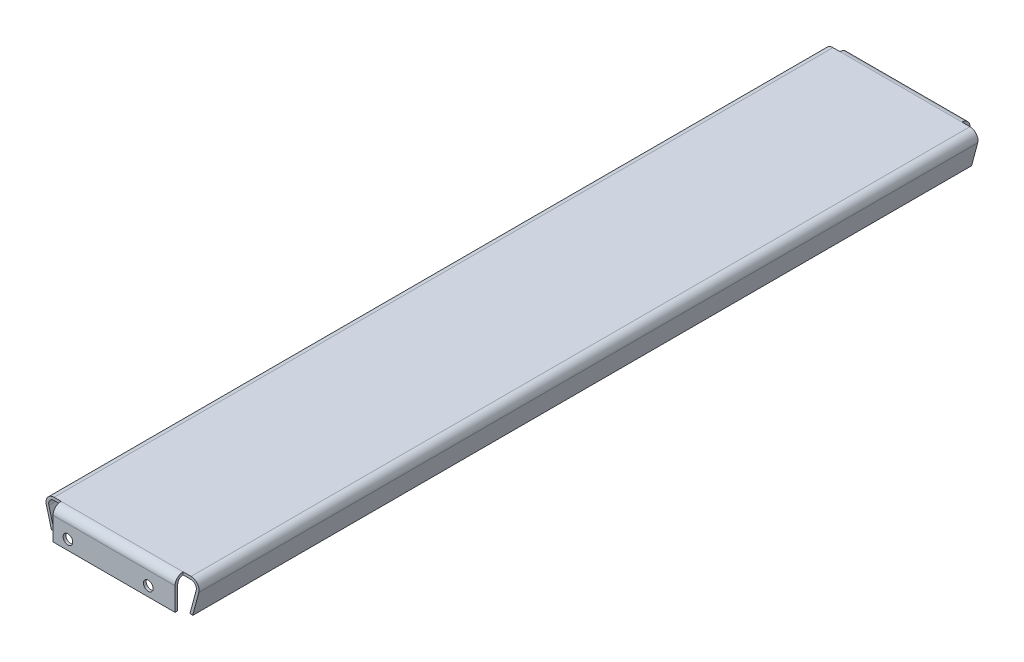
ISO-10303-21;
HEADER;
FILE_DESCRIPTION(('STEP AP214'),'2;1');
FILE_NAME('part.step','',(''),(''),'','','');
FILE_SCHEMA(('AUTOMOTIVE_DESIGN { 1 0 10303 214 1 1 1 1 }'));
ENDSEC;
DATA;
#1=APPLICATION_CONTEXT('core data for automotive mechanical design processes');
#2=APPLICATION_PROTOCOL_DEFINITION('international standard','automotive_design',2000,#1);
#3=PRODUCT_CONTEXT('',#1,'mechanical');
#4=PRODUCT('Part','Part','',(#3));
#5=PRODUCT_RELATED_PRODUCT_CATEGORY('part','',(#4));
#6=PRODUCT_DEFINITION_FORMATION('','',#4);
#7=PRODUCT_DEFINITION_CONTEXT('part definition',#1,'design');
#8=PRODUCT_DEFINITION('design','',#6,#7);
#9=PRODUCT_DEFINITION_SHAPE('','',#8);
#10=(LENGTH_UNIT() NAMED_UNIT(*) SI_UNIT(.MILLI.,.METRE.));
#11=(NAMED_UNIT(*) PLANE_ANGLE_UNIT() SI_UNIT($,.RADIAN.));
#12=(NAMED_UNIT(*) SI_UNIT($,.STERADIAN.) SOLID_ANGLE_UNIT());
#13=UNCERTAINTY_MEASURE_WITH_UNIT(LENGTH_MEASURE(1.E-05),#10,'distance_accuracy_value','');
#14=(GEOMETRIC_REPRESENTATION_CONTEXT(3) GLOBAL_UNCERTAINTY_ASSIGNED_CONTEXT((#13)) GLOBAL_UNIT_ASSIGNED_CONTEXT((#10,
#11,#12)) REPRESENTATION_CONTEXT('',''));
#15=CARTESIAN_POINT('',(0.,0.,0.));
#16=DIRECTION('',(0.,0.,1.));
#17=DIRECTION('',(1.,0.,0.));
#18=AXIS2_PLACEMENT_3D('',#15,#16,#17);
#19=CARTESIAN_POINT('',(105.011062785215,-8.89529991418879,-302.426822511449));
#20=DIRECTION('',(0.,1.,0.));
#21=DIRECTION('',(0.,0.,1.));
#22=AXIS2_PLACEMENT_3D('',#19,#20,#21);
#23=PLANE('',#22);
#24=DIRECTION('',(1.,0.,0.));
#25=VECTOR('',#24,1.);
#26=CARTESIAN_POINT('',(57.3565,-8.89529991418875,-221.099));
#27=LINE('',#26,#25);
#28=CARTESIAN_POINT('',(-35.4355117298732,-8.89529991418879,-221.099));
#29=VERTEX_POINT('',#28);
#30=CARTESIAN_POINT('',(32.9178736396681,-8.89529991418879,-221.099));
#31=VERTEX_POINT('',#30);
#32=EDGE_CURVE('E271',#29,#31,#27,.T.);
#33=ORIENTED_EDGE('',*,*,#32,.F.);
#34=DIRECTION('',(0.,0.,1.));
#35=VECTOR('',#34,1.);
#36=CARTESIAN_POINT('',(-35.4355117298732,-8.89529991418879,-302.426822511449));
#37=LINE('',#36,#35);
#38=CARTESIAN_POINT('',(-35.4355117298732,-8.89529991418879,-222.599));
#39=VERTEX_POINT('',#38);
#40=EDGE_CURVE('E156',#39,#29,#37,.T.);
#41=ORIENTED_EDGE('',*,*,#40,.F.);
#42=DIRECTION('',(-1.,0.,0.));
#43=VECTOR('',#42,1.);
#44=CARTESIAN_POINT('',(-57.3565,-8.89529991418875,-222.599));
#45=LINE('',#44,#43);
#46=CARTESIAN_POINT('',(32.9178736396681,-8.89529991418879,-222.599));
#47=VERTEX_POINT('',#46);
#48=EDGE_CURVE('E286',#47,#39,#45,.T.);
#49=ORIENTED_EDGE('',*,*,#48,.F.);
#50=DIRECTION('',(0.,0.,1.));
#51=VECTOR('',#50,1.);
#52=CARTESIAN_POINT('',(32.9178736396681,-8.89529991418879,-302.426822511449));
#53=LINE('',#52,#51);
#54=EDGE_CURVE('E290',#31,#47,#53,.F.);
#55=ORIENTED_EDGE('',*,*,#54,.F.);
#56=EDGE_LOOP('',(#33,#41,#49,#55));
#57=FACE_BOUND('',#56,.T.);
#58=ADVANCED_FACE('F15',(#57),#23,.F.);
#59=CARTESIAN_POINT('',(17.9178736396681,-3.46341447025817,245.074174975933));
#60=DIRECTION('',(0.,0.,1.));
#61=DIRECTION('',(0.,-1.,0.));
#62=AXIS2_PLACEMENT_3D('',#59,#60,#61);
#63=CYLINDRICAL_SURFACE('',#62,2.7);
#64=CARTESIAN_POINT('',(17.9178736396681,-3.46341447025807,-222.599));
#65=DIRECTION('',(0.,0.,1.));
#66=DIRECTION('',(0.,-1.,0.));
#67=AXIS2_PLACEMENT_3D('',#64,#65,#66);
#68=CIRCLE('',#67,2.7);
#69=CARTESIAN_POINT('',(17.9178736396681,-6.16341447025807,-222.599));
#70=VERTEX_POINT('',#69);
#71=EDGE_CURVE('E19',#70,#70,#68,.T.);
#72=ORIENTED_EDGE('',*,*,#71,.F.);
#73=EDGE_LOOP('',(#72));
#74=FACE_BOUND('',#73,.T.);
#75=CARTESIAN_POINT('',(17.9178736396681,-3.46341447025807,-221.099));
#76=DIRECTION('',(0.,0.,1.));
#77=DIRECTION('',(0.,-1.,0.));
#78=AXIS2_PLACEMENT_3D('',#75,#76,#77);
#79=CIRCLE('',#78,2.7);
#80=CARTESIAN_POINT('',(17.9178736396681,-6.16341447025807,-221.099));
#81=VERTEX_POINT('',#80);
#82=EDGE_CURVE('E268',#81,#81,#79,.F.);
#83=ORIENTED_EDGE('',*,*,#82,.F.);
#84=EDGE_LOOP('',(#83));
#85=FACE_BOUND('',#84,.T.);
#86=ADVANCED_FACE('F667',(#74,#85),#63,.F.);
#87=CARTESIAN_POINT('',(-27.0821263603319,-3.46341447025817,245.074174975933));
#88=DIRECTION('',(0.,0.,1.));
#89=DIRECTION('',(0.,-1.,0.));
#90=AXIS2_PLACEMENT_3D('',#87,#88,#89);
#91=CYLINDRICAL_SURFACE('',#90,2.7);
#92=CARTESIAN_POINT('',(-27.0821263603319,-3.46341447025807,-222.599));
#93=DIRECTION('',(0.,0.,1.));
#94=DIRECTION('',(0.,-1.,0.));
#95=AXIS2_PLACEMENT_3D('',#92,#93,#94);
#96=CIRCLE('',#95,2.7);
#97=CARTESIAN_POINT('',(-27.0821263603319,-6.16341447025807,-222.599));
#98=VERTEX_POINT('',#97);
#99=EDGE_CURVE('E278',#98,#98,#96,.T.);
#100=ORIENTED_EDGE('',*,*,#99,.F.);
#101=EDGE_LOOP('',(#100));
#102=FACE_BOUND('',#101,.T.);
#103=CARTESIAN_POINT('',(-27.0821263603319,-3.46341447025807,-221.099));
#104=DIRECTION('',(0.,0.,1.));
#105=DIRECTION('',(0.,-1.,0.));
#106=AXIS2_PLACEMENT_3D('',#103,#104,#105);
#107=CIRCLE('',#106,2.7);
#108=CARTESIAN_POINT('',(-27.0821263603319,-6.16341447025807,-221.099));
#109=VERTEX_POINT('',#108);
#110=EDGE_CURVE('E265',#109,#109,#107,.F.);
#111=ORIENTED_EDGE('',*,*,#110,.F.);
#112=EDGE_LOOP('',(#111));
#113=FACE_BOUND('',#112,.T.);
#114=ADVANCED_FACE('F671',(#102,#113),#91,.F.);
#115=CARTESIAN_POINT('',(-57.3565,-8.89529991418879,-222.599));
#116=DIRECTION('',(0.,0.,-1.));
#117=DIRECTION('',(-1.,0.,0.));
#118=AXIS2_PLACEMENT_3D('',#115,#116,#117);
#119=PLANE('',#118);
#120=ORIENTED_EDGE('',*,*,#99,.T.);
#121=EDGE_LOOP('',(#120));
#122=FACE_BOUND('',#121,.T.);
#123=ORIENTED_EDGE('',*,*,#71,.T.);
#124=EDGE_LOOP('',(#123));
#125=FACE_BOUND('',#124,.T.);
#126=ORIENTED_EDGE('',*,*,#48,.T.);
#127=DIRECTION('',(0.,1.,0.));
#128=VECTOR('',#127,1.);
#129=CARTESIAN_POINT('',(-35.4355117298732,-0.179357192223455,-222.599));
#130=LINE('',#129,#128);
#131=CARTESIAN_POINT('',(-35.4355117298732,4.03658552974194,-222.599));
#132=VERTEX_POINT('',#131);
#133=EDGE_CURVE('E403',#39,#132,#130,.T.);
#134=ORIENTED_EDGE('',*,*,#133,.T.);
#135=DIRECTION('',(-1.,0.,0.));
#136=VECTOR('',#135,1.);
#137=CARTESIAN_POINT('',(-1.25881904510251,4.03658552974196,-222.599));
#138=LINE('',#137,#136);
#139=CARTESIAN_POINT('',(32.9178736396681,4.03658552974195,-222.599));
#140=VERTEX_POINT('',#139);
#141=EDGE_CURVE('E148',#140,#132,#138,.T.);
#142=ORIENTED_EDGE('',*,*,#141,.F.);
#143=DIRECTION('',(0.,-1.,0.));
#144=VECTOR('',#143,1.);
#145=CARTESIAN_POINT('',(32.9178736396681,-0.179357192223449,-222.599));
#146=LINE('',#145,#144);
#147=EDGE_CURVE('E260',#140,#47,#146,.T.);
#148=ORIENTED_EDGE('',*,*,#147,.T.);
#149=EDGE_LOOP('',(#126,#134,#142,#148));
#150=FACE_BOUND('',#149,.T.);
#151=ADVANCED_FACE('F498',(#122,#125,#150),#119,.T.);
#152=CARTESIAN_POINT('',(38.2627623791018,-9.96786209966535,-236.78));
#153=DIRECTION('',(-0.258819045102521,-0.965925826289068,0.));
#154=DIRECTION('',(0.965925826289068,-0.258819045102521,0.));
#155=AXIS2_PLACEMENT_3D('',#152,#153,#154);
#156=PLANE('',#155);
#157=DIRECTION('',(0.965925826289068,-0.258819045102521,0.));
#158=VECTOR('',#157,1.);
#159=CARTESIAN_POINT('',(38.2627623791018,-9.96786209966543,218.099));
#160=LINE('',#159,#158);
#161=CARTESIAN_POINT('',(38.2627623791017,-9.96786209966542,218.099));
#162=VERTEX_POINT('',#161);
#163=CARTESIAN_POINT('',(36.8138736396681,-9.57963353201164,218.099));
#164=VERTEX_POINT('',#163);
#165=EDGE_CURVE('E283',#162,#164,#160,.F.);
#166=ORIENTED_EDGE('',*,*,#165,.T.);
#167=DIRECTION('',(0.,0.,1.));
#168=VECTOR('',#167,1.);
#169=CARTESIAN_POINT('',(36.8138736396682,-9.57963353201166,-236.78));
#170=LINE('',#169,#168);
#171=CARTESIAN_POINT('',(36.8138736396681,-9.5796335320116,-218.099));
#172=VERTEX_POINT('',#171);
#173=EDGE_CURVE('E383',#172,#164,#170,.T.);
#174=ORIENTED_EDGE('',*,*,#173,.F.);
#175=DIRECTION('',(0.965925826289068,-0.258819045102521,0.));
#176=VECTOR('',#175,1.);
#177=CARTESIAN_POINT('',(38.2627623791018,-9.96786209966535,-218.099));
#178=LINE('',#177,#176);
#179=CARTESIAN_POINT('',(38.2627623791017,-9.96786209966538,-218.099));
#180=VERTEX_POINT('',#179);
#181=EDGE_CURVE('E280',#172,#180,#178,.T.);
#182=ORIENTED_EDGE('',*,*,#181,.T.);
#183=DIRECTION('',(0.,0.,1.));
#184=VECTOR('',#183,1.);
#185=CARTESIAN_POINT('',(38.2627623791017,-9.96786209966544,-236.78));
#186=LINE('',#185,#184);
#187=EDGE_CURVE('E380',#162,#180,#186,.F.);
#188=ORIENTED_EDGE('',*,*,#187,.F.);
#189=EDGE_LOOP('',(#166,#174,#182,#188));
#190=FACE_BOUND('',#189,.T.);
#191=ADVANCED_FACE('F533',(#190),#156,.T.);
#192=CARTESIAN_POINT('',(105.011062785215,-8.89529991418872,302.426822511449));
#193=DIRECTION('',(0.,-1.,0.));
#194=DIRECTION('',(0.,0.,-1.));
#195=AXIS2_PLACEMENT_3D('',#192,#193,#194);
#196=PLANE('',#195);
#197=DIRECTION('',(0.,0.,-1.));
#198=VECTOR('',#197,1.);
#199=CARTESIAN_POINT('',(-35.4355117298732,-8.89529991418872,302.426822511449));
#200=LINE('',#199,#198);
#201=CARTESIAN_POINT('',(-35.4355117298732,-8.89529991418874,222.599));
#202=VERTEX_POINT('',#201);
#203=CARTESIAN_POINT('',(-35.4355117298732,-8.89529991418874,221.099));
#204=VERTEX_POINT('',#203);
#205=EDGE_CURVE('E320',#202,#204,#200,.T.);
#206=ORIENTED_EDGE('',*,*,#205,.T.);
#207=DIRECTION('',(-1.,0.,0.));
#208=VECTOR('',#207,1.);
#209=CARTESIAN_POINT('',(57.3565,-8.89529991418875,221.099));
#210=LINE('',#209,#208);
#211=CARTESIAN_POINT('',(32.9178736396681,-8.89529991418874,221.099));
#212=VERTEX_POINT('',#211);
#213=EDGE_CURVE('E257',#212,#204,#210,.T.);
#214=ORIENTED_EDGE('',*,*,#213,.F.);
#215=DIRECTION('',(0.,0.,-1.));
#216=VECTOR('',#215,1.);
#217=CARTESIAN_POINT('',(32.9178736396681,-8.89529991418872,302.426822511449));
#218=LINE('',#217,#216);
#219=CARTESIAN_POINT('',(32.9178736396681,-8.89529991418874,222.599));
#220=VERTEX_POINT('',#219);
#221=EDGE_CURVE('E317',#212,#220,#218,.F.);
#222=ORIENTED_EDGE('',*,*,#221,.T.);
#223=DIRECTION('',(1.,0.,0.));
#224=VECTOR('',#223,1.);
#225=CARTESIAN_POINT('',(-57.3565,-8.89529991418875,222.599));
#226=LINE('',#225,#224);
#227=EDGE_CURVE('E277',#202,#220,#226,.T.);
#228=ORIENTED_EDGE('',*,*,#227,.F.);
#229=EDGE_LOOP('',(#206,#214,#222,#228));
#230=FACE_BOUND('',#229,.T.);
#231=ADVANCED_FACE('F507',(#230),#196,.T.);
#232=CARTESIAN_POINT('',(17.9178736396681,-3.46341447025807,222.599));
#233=DIRECTION('',(0.,0.,-1.));
#234=DIRECTION('',(-1.,0.,0.));
#235=AXIS2_PLACEMENT_3D('',#232,#233,#234);
#236=CYLINDRICAL_SURFACE('',#235,2.7);
#237=CARTESIAN_POINT('',(17.9178736396681,-3.46341447025807,222.599));
#238=DIRECTION('',(0.,0.,-1.));
#239=DIRECTION('',(-1.,0.,0.));
#240=AXIS2_PLACEMENT_3D('',#237,#238,#239);
#241=CIRCLE('',#240,2.7);
#242=CARTESIAN_POINT('',(15.2178736396681,-3.46341447025807,222.599));
#243=VERTEX_POINT('',#242);
#244=EDGE_CURVE('E275',#243,#243,#241,.T.);
#245=ORIENTED_EDGE('',*,*,#244,.F.);
#246=EDGE_LOOP('',(#245));
#247=FACE_BOUND('',#246,.T.);
#248=CARTESIAN_POINT('',(17.9178736396681,-3.46341447025805,221.099));
#249=DIRECTION('',(0.,0.,-1.));
#250=DIRECTION('',(-1.,0.,0.));
#251=AXIS2_PLACEMENT_3D('',#248,#249,#250);
#252=CIRCLE('',#251,2.7);
#253=CARTESIAN_POINT('',(15.2178736396681,-3.46341447025805,221.099));
#254=VERTEX_POINT('',#253);
#255=EDGE_CURVE('E254',#254,#254,#252,.F.);
#256=ORIENTED_EDGE('',*,*,#255,.F.);
#257=EDGE_LOOP('',(#256));
#258=FACE_BOUND('',#257,.T.);
#259=ADVANCED_FACE('F660',(#247,#258),#236,.F.);
#260=CARTESIAN_POINT('',(-27.0821263603319,-3.46341447025807,222.599));
#261=DIRECTION('',(0.,0.,-1.));
#262=DIRECTION('',(0.,1.,0.));
#263=AXIS2_PLACEMENT_3D('',#260,#261,#262);
#264=CYLINDRICAL_SURFACE('',#263,2.7);
#265=CARTESIAN_POINT('',(-27.0821263603319,-3.46341447025807,222.599));
#266=DIRECTION('',(0.,0.,-1.));
#267=DIRECTION('',(0.,1.,0.));
#268=AXIS2_PLACEMENT_3D('',#265,#266,#267);
#269=CIRCLE('',#268,2.7);
#270=CARTESIAN_POINT('',(-27.0821263603319,-0.763414470258064,222.599));
#271=VERTEX_POINT('',#270);
#272=EDGE_CURVE('E272',#271,#271,#269,.T.);
#273=ORIENTED_EDGE('',*,*,#272,.F.);
#274=EDGE_LOOP('',(#273));
#275=FACE_BOUND('',#274,.T.);
#276=CARTESIAN_POINT('',(-27.0821263603319,-3.46341447025805,221.099));
#277=DIRECTION('',(0.,0.,-1.));
#278=DIRECTION('',(0.,1.,0.));
#279=AXIS2_PLACEMENT_3D('',#276,#277,#278);
#280=CIRCLE('',#279,2.7);
#281=CARTESIAN_POINT('',(-27.0821263603319,-0.763414470258048,221.099));
#282=VERTEX_POINT('',#281);
#283=EDGE_CURVE('E251',#282,#282,#280,.F.);
#284=ORIENTED_EDGE('',*,*,#283,.F.);
#285=EDGE_LOOP('',(#284));
#286=FACE_BOUND('',#285,.T.);
#287=ADVANCED_FACE('F657',(#275,#286),#264,.F.);
#288=CARTESIAN_POINT('',(-57.3565,464.664700085811,222.599));
#289=DIRECTION('',(0.,0.,1.));
#290=DIRECTION('',(1.,0.,0.));
#291=AXIS2_PLACEMENT_3D('',#288,#289,#290);
#292=PLANE('',#291);
#293=ORIENTED_EDGE('',*,*,#272,.T.);
#294=EDGE_LOOP('',(#293));
#295=FACE_BOUND('',#294,.T.);
#296=ORIENTED_EDGE('',*,*,#244,.T.);
#297=EDGE_LOOP('',(#296));
#298=FACE_BOUND('',#297,.T.);
#299=ORIENTED_EDGE('',*,*,#227,.T.);
#300=DIRECTION('',(0.,1.,0.));
#301=VECTOR('',#300,1.);
#302=CARTESIAN_POINT('',(32.9178736396681,-8.89529991418875,222.599));
#303=LINE('',#302,#301);
#304=CARTESIAN_POINT('',(32.9178736396681,4.03658552974193,222.599));
#305=VERTEX_POINT('',#304);
#306=EDGE_CURVE('E354',#220,#305,#303,.T.);
#307=ORIENTED_EDGE('',*,*,#306,.T.);
#308=DIRECTION('',(1.,0.,0.));
#309=VECTOR('',#308,1.);
#310=CARTESIAN_POINT('',(-1.25881904510251,4.03658552974193,222.599));
#311=LINE('',#310,#309);
#312=CARTESIAN_POINT('',(-35.4355117298732,4.03658552974193,222.599));
#313=VERTEX_POINT('',#312);
#314=EDGE_CURVE('E304',#313,#305,#311,.T.);
#315=ORIENTED_EDGE('',*,*,#314,.F.);
#316=DIRECTION('',(0.,1.,0.));
#317=VECTOR('',#316,1.);
#318=CARTESIAN_POINT('',(-35.4355117298732,-8.89529991418875,222.599));
#319=LINE('',#318,#317);
#320=EDGE_CURVE('E246',#313,#202,#319,.F.);
#321=ORIENTED_EDGE('',*,*,#320,.T.);
#322=EDGE_LOOP('',(#299,#307,#315,#321));
#323=FACE_BOUND('',#322,.T.);
#324=ADVANCED_FACE('F353',(#295,#298,#323),#292,.T.);
#325=CARTESIAN_POINT('',(-1.25881904510251,4.03658552974193,-218.099));
#326=DIRECTION('',(-1.,0.,0.));
#327=DIRECTION('',(0.,-1.,0.));
#328=AXIS2_PLACEMENT_3D('',#325,#326,#327);
#329=CYLINDRICAL_SURFACE('',#328,4.5);
#330=CARTESIAN_POINT('',(-35.4355117298732,4.03658552974193,-218.099));
#331=DIRECTION('',(-1.,0.,0.));
#332=DIRECTION('',(0.,-1.,0.));
#333=AXIS2_PLACEMENT_3D('',#330,#331,#332);
#334=CIRCLE('',#333,4.5);
#335=CARTESIAN_POINT('',(-35.4355117298732,8.53658552974193,-218.099));
#336=VERTEX_POINT('',#335);
#337=EDGE_CURVE('E262',#132,#336,#334,.F.);
#338=ORIENTED_EDGE('',*,*,#337,.T.);
#339=DIRECTION('',(1.,0.,0.));
#340=VECTOR('',#339,1.);
#341=CARTESIAN_POINT('',(-57.3565,8.53658552974193,-218.099));
#342=LINE('',#341,#340);
#343=CARTESIAN_POINT('',(32.9178736396681,8.53658552974193,-218.099));
#344=VERTEX_POINT('',#343);
#345=EDGE_CURVE('E392',#344,#336,#342,.F.);
#346=ORIENTED_EDGE('',*,*,#345,.F.);
#347=CARTESIAN_POINT('',(32.9178736396681,4.03658552974193,-218.099));
#348=DIRECTION('',(-1.,0.,0.));
#349=DIRECTION('',(0.,-1.,0.));
#350=AXIS2_PLACEMENT_3D('',#347,#348,#349);
#351=CIRCLE('',#350,4.5);
#352=EDGE_CURVE('E258',#344,#140,#351,.T.);
#353=ORIENTED_EDGE('',*,*,#352,.T.);
#354=ORIENTED_EDGE('',*,*,#141,.T.);
#355=EDGE_LOOP('',(#338,#346,#353,#354));
#356=FACE_BOUND('',#355,.T.);
#357=ADVANCED_FACE('F492',(#356),#329,.T.);
#358=CARTESIAN_POINT('',(-1.25881904510251,4.03658552974193,218.099));
#359=DIRECTION('',(1.,0.,0.));
#360=DIRECTION('',(0.,1.,0.));
#361=AXIS2_PLACEMENT_3D('',#358,#359,#360);
#362=CYLINDRICAL_SURFACE('',#361,4.5);
#363=CARTESIAN_POINT('',(32.9178736396681,4.03658552974193,218.099));
#364=DIRECTION('',(1.,0.,0.));
#365=DIRECTION('',(0.,1.,0.));
#366=AXIS2_PLACEMENT_3D('',#363,#364,#365);
#367=CIRCLE('',#366,4.5);
#368=CARTESIAN_POINT('',(32.9178736396681,8.53658552974193,218.099));
#369=VERTEX_POINT('',#368);
#370=EDGE_CURVE('E248',#305,#369,#367,.F.);
#371=ORIENTED_EDGE('',*,*,#370,.T.);
#372=DIRECTION('',(1.,0.,0.));
#373=VECTOR('',#372,1.);
#374=CARTESIAN_POINT('',(-57.3565,8.53658552974193,218.099));
#375=LINE('',#374,#373);
#376=CARTESIAN_POINT('',(-35.4355117298732,8.53658552974193,218.099));
#377=VERTEX_POINT('',#376);
#378=EDGE_CURVE('E378',#377,#369,#375,.T.);
#379=ORIENTED_EDGE('',*,*,#378,.F.);
#380=CARTESIAN_POINT('',(-35.4355117298732,4.03658552974193,218.099));
#381=DIRECTION('',(1.,0.,0.));
#382=DIRECTION('',(0.,1.,0.));
#383=AXIS2_PLACEMENT_3D('',#380,#381,#382);
#384=CIRCLE('',#383,4.5);
#385=EDGE_CURVE('E243',#377,#313,#384,.T.);
#386=ORIENTED_EDGE('',*,*,#385,.T.);
#387=ORIENTED_EDGE('',*,*,#314,.T.);
#388=EDGE_LOOP('',(#371,#379,#386,#387));
#389=FACE_BOUND('',#388,.T.);
#390=ADVANCED_FACE('F509',(#389),#362,.T.);
#391=CARTESIAN_POINT('',(-39.3315117298731,-7.6477818794335,-236.78));
#392=DIRECTION('',(0.258819045102521,-0.965925826289068,0.));
#393=DIRECTION('',(0.965925826289068,0.258819045102521,0.));
#394=AXIS2_PLACEMENT_3D('',#391,#392,#393);
#395=PLANE('',#394);
#396=DIRECTION('',(0.965925826289068,0.258819045102521,0.));
#397=VECTOR('',#396,1.);
#398=CARTESIAN_POINT('',(-39.3315117298732,-7.64778187943342,218.099));
#399=LINE('',#398,#397);
#400=CARTESIAN_POINT('',(-39.3315117298732,-7.64778187943343,218.099));
#401=VERTEX_POINT('',#400);
#402=CARTESIAN_POINT('',(-40.7804004693068,-8.03601044708722,218.099));
#403=VERTEX_POINT('',#402);
#404=EDGE_CURVE('E184',#401,#403,#399,.F.);
#405=ORIENTED_EDGE('',*,*,#404,.T.);
#406=DIRECTION('',(0.,0.,1.));
#407=VECTOR('',#406,1.);
#408=CARTESIAN_POINT('',(-40.7804004693068,-8.0360104470872,-236.78));
#409=LINE('',#408,#407);
#410=CARTESIAN_POINT('',(-40.7804004693068,-8.03601044708726,-218.099));
#411=VERTEX_POINT('',#410);
#412=EDGE_CURVE('E436',#411,#403,#409,.T.);
#413=ORIENTED_EDGE('',*,*,#412,.F.);
#414=DIRECTION('',(0.965925826289068,0.258819045102521,0.));
#415=VECTOR('',#414,1.);
#416=CARTESIAN_POINT('',(-39.3315117298731,-7.6477818794335,-218.099));
#417=LINE('',#416,#415);
#418=CARTESIAN_POINT('',(-39.3315117298732,-7.64778187943349,-218.099));
#419=VERTEX_POINT('',#418);
#420=EDGE_CURVE('E308',#411,#419,#417,.T.);
#421=ORIENTED_EDGE('',*,*,#420,.T.);
#422=DIRECTION('',(0.,0.,1.));
#423=VECTOR('',#422,1.);
#424=CARTESIAN_POINT('',(-39.3315117298731,-7.64778187943341,-236.78));
#425=LINE('',#424,#423);
#426=EDGE_CURVE('E429',#401,#419,#425,.F.);
#427=ORIENTED_EDGE('',*,*,#426,.F.);
#428=EDGE_LOOP('',(#405,#413,#421,#427));
#429=FACE_BOUND('',#428,.T.);
#430=ADVANCED_FACE('F689',(#429),#395,.T.);
#431=CARTESIAN_POINT('',(57.3565,-8.89529991418879,-221.099));
#432=DIRECTION('',(0.,0.,1.));
#433=DIRECTION('',(1.,0.,0.));
#434=AXIS2_PLACEMENT_3D('',#431,#432,#433);
#435=PLANE('',#434);
#436=ORIENTED_EDGE('',*,*,#110,.T.);
#437=EDGE_LOOP('',(#436));
#438=FACE_BOUND('',#437,.T.);
#439=ORIENTED_EDGE('',*,*,#82,.T.);
#440=EDGE_LOOP('',(#439));
#441=FACE_BOUND('',#440,.T.);
#442=ORIENTED_EDGE('',*,*,#32,.T.);
#443=DIRECTION('',(0.,1.,0.));
#444=VECTOR('',#443,1.);
#445=CARTESIAN_POINT('',(32.9178736396681,-0.17935719222345,-221.099));
#446=LINE('',#445,#444);
#447=CARTESIAN_POINT('',(32.9178736396681,4.03658552974195,-221.099));
#448=VERTEX_POINT('',#447);
#449=EDGE_CURVE('E388',#31,#448,#446,.T.);
#450=ORIENTED_EDGE('',*,*,#449,.T.);
#451=DIRECTION('',(-1.,0.,0.));
#452=VECTOR('',#451,1.);
#453=CARTESIAN_POINT('',(-1.25881904510251,4.03658552974196,-221.099));
#454=LINE('',#453,#452);
#455=CARTESIAN_POINT('',(-35.4355117298732,4.03658552974194,-221.099));
#456=VERTEX_POINT('',#455);
#457=EDGE_CURVE('E233',#448,#456,#454,.T.);
#458=ORIENTED_EDGE('',*,*,#457,.T.);
#459=DIRECTION('',(0.,-1.,0.));
#460=VECTOR('',#459,1.);
#461=CARTESIAN_POINT('',(-35.4355117298732,-0.179357192223455,-221.099));
#462=LINE('',#461,#460);
#463=EDGE_CURVE('E264',#456,#29,#462,.T.);
#464=ORIENTED_EDGE('',*,*,#463,.T.);
#465=EDGE_LOOP('',(#442,#450,#458,#464));
#466=FACE_BOUND('',#465,.T.);
#467=ADVANCED_FACE('F407',(#438,#441,#466),#435,.T.);
#468=CARTESIAN_POINT('',(-35.4355117298732,-8.89529991418883,-222.599));
#469=DIRECTION('',(1.,0.,0.));
#470=DIRECTION('',(0.,1.,0.));
#471=AXIS2_PLACEMENT_3D('',#468,#469,#470);
#472=PLANE('',#471);
#473=ORIENTED_EDGE('',*,*,#40,.T.);
#474=ORIENTED_EDGE('',*,*,#463,.F.);
#475=CARTESIAN_POINT('',(-35.4355117298732,4.03658552974193,-218.099));
#476=DIRECTION('',(-1.,0.,0.));
#477=DIRECTION('',(0.,-1.,0.));
#478=AXIS2_PLACEMENT_3D('',#475,#476,#477);
#479=CIRCLE('',#478,3.);
#480=CARTESIAN_POINT('',(-35.4355117298732,7.03658552974193,-218.099));
#481=VERTEX_POINT('',#480);
#482=EDGE_CURVE('E231',#456,#481,#479,.F.);
#483=ORIENTED_EDGE('',*,*,#482,.T.);
#484=DIRECTION('',(0.,-1.,0.));
#485=VECTOR('',#484,1.);
#486=CARTESIAN_POINT('',(-35.4355117298732,0.250287541327314,-218.099));
#487=LINE('',#486,#485);
#488=EDGE_CURVE('E242',#336,#481,#487,.T.);
#489=ORIENTED_EDGE('',*,*,#488,.F.);
#490=ORIENTED_EDGE('',*,*,#337,.F.);
#491=ORIENTED_EDGE('',*,*,#133,.F.);
#492=EDGE_LOOP('',(#473,#474,#483,#489,#490,#491));
#493=FACE_BOUND('',#492,.T.);
#494=ADVANCED_FACE('F410',(#493),#472,.F.);
#495=CARTESIAN_POINT('',(32.9178736396681,8.53658552974194,-222.599));
#496=DIRECTION('',(-1.,0.,0.));
#497=DIRECTION('',(0.,-1.,0.));
#498=AXIS2_PLACEMENT_3D('',#495,#496,#497);
#499=PLANE('',#498);
#500=ORIENTED_EDGE('',*,*,#54,.T.);
#501=ORIENTED_EDGE('',*,*,#147,.F.);
#502=ORIENTED_EDGE('',*,*,#352,.F.);
#503=DIRECTION('',(0.,1.,0.));
#504=VECTOR('',#503,1.);
#505=CARTESIAN_POINT('',(32.9178736396681,-0.17935719222345,-218.099));
#506=LINE('',#505,#504);
#507=CARTESIAN_POINT('',(32.9178736396681,7.03658552974193,-218.099));
#508=VERTEX_POINT('',#507);
#509=EDGE_CURVE('E261',#508,#344,#506,.T.);
#510=ORIENTED_EDGE('',*,*,#509,.F.);
#511=CARTESIAN_POINT('',(32.9178736396681,4.03658552974193,-218.099));
#512=DIRECTION('',(-1.,0.,0.));
#513=DIRECTION('',(0.,-1.,0.));
#514=AXIS2_PLACEMENT_3D('',#511,#512,#513);
#515=CIRCLE('',#514,3.);
#516=EDGE_CURVE('E228',#508,#448,#515,.T.);
#517=ORIENTED_EDGE('',*,*,#516,.T.);
#518=ORIENTED_EDGE('',*,*,#449,.F.);
#519=EDGE_LOOP('',(#500,#501,#502,#510,#517,#518));
#520=FACE_BOUND('',#519,.T.);
#521=ADVANCED_FACE('F496',(#520),#499,.F.);
#522=CARTESIAN_POINT('',(36.8138736396682,-9.57963353201157,-236.78));
#523=DIRECTION('',(-0.965925826289068,0.258819045102521,0.));
#524=DIRECTION('',(-0.258819045102521,-0.965925826289068,0.));
#525=AXIS2_PLACEMENT_3D('',#522,#523,#524);
#526=PLANE('',#525);
#527=DIRECTION('',(-0.25881904510252,-0.965925826289068,0.));
#528=VECTOR('',#527,1.);
#529=CARTESIAN_POINT('',(40.2542774788672,3.26012839443437,218.099));
#530=LINE('',#529,#528);
#531=CARTESIAN_POINT('',(40.2542774788672,3.26012839443437,218.099));
#532=VERTEX_POINT('',#531);
#533=EDGE_CURVE('E213',#532,#164,#530,.T.);
#534=ORIENTED_EDGE('',*,*,#533,.F.);
#535=DIRECTION('',(0.,0.,-1.));
#536=VECTOR('',#535,1.);
#537=CARTESIAN_POINT('',(40.2542774788672,3.26012839443437,0.));
#538=LINE('',#537,#536);
#539=CARTESIAN_POINT('',(40.2542774788672,3.26012839443438,-218.099));
#540=VERTEX_POINT('',#539);
#541=EDGE_CURVE('E217',#532,#540,#538,.T.);
#542=ORIENTED_EDGE('',*,*,#541,.T.);
#543=DIRECTION('',(0.258819045102521,0.965925826289068,0.));
#544=VECTOR('',#543,1.);
#545=CARTESIAN_POINT('',(36.8138736396681,-9.57963353201164,-218.099));
#546=LINE('',#545,#544);
#547=EDGE_CURVE('E218',#172,#540,#546,.T.);
#548=ORIENTED_EDGE('',*,*,#547,.F.);
#549=ORIENTED_EDGE('',*,*,#173,.T.);
#550=EDGE_LOOP('',(#534,#542,#548,#549));
#551=FACE_BOUND('',#550,.T.);
#552=ADVANCED_FACE('F530',(#551),#526,.T.);
#553=CARTESIAN_POINT('',(67.9526714999473,100.836387211433,-236.78));
#554=DIRECTION('',(0.965925826289068,-0.258819045102521,0.));
#555=DIRECTION('',(0.258819045102521,0.965925826289068,0.));
#556=AXIS2_PLACEMENT_3D('',#553,#554,#555);
#557=PLANE('',#556);
#558=DIRECTION('',(0.25881904510252,0.965925826289068,0.));
#559=VECTOR('',#558,1.);
#560=CARTESIAN_POINT('',(38.2627623791017,-9.96786209966542,218.099));
#561=LINE('',#560,#559);
#562=CARTESIAN_POINT('',(41.7031662183008,2.87189982678058,218.099));
#563=VERTEX_POINT('',#562);
#564=EDGE_CURVE('E209',#162,#563,#561,.T.);
#565=ORIENTED_EDGE('',*,*,#564,.F.);
#566=ORIENTED_EDGE('',*,*,#187,.T.);
#567=DIRECTION('',(-0.25881904510252,-0.965925826289069,0.));
#568=VECTOR('',#567,1.);
#569=CARTESIAN_POINT('',(41.7031662183008,2.87189982678059,-218.099));
#570=LINE('',#569,#568);
#571=CARTESIAN_POINT('',(41.7031662183008,2.8718998267806,-218.099));
#572=VERTEX_POINT('',#571);
#573=EDGE_CURVE('E221',#572,#180,#570,.T.);
#574=ORIENTED_EDGE('',*,*,#573,.F.);
#575=DIRECTION('',(0.,0.,-1.));
#576=VECTOR('',#575,1.);
#577=CARTESIAN_POINT('',(41.7031662183008,2.87189982678059,0.));
#578=LINE('',#577,#576);
#579=EDGE_CURVE('E346',#563,#572,#578,.T.);
#580=ORIENTED_EDGE('',*,*,#579,.F.);
#581=EDGE_LOOP('',(#565,#566,#574,#580));
#582=FACE_BOUND('',#581,.T.);
#583=ADVANCED_FACE('F538',(#582),#557,.T.);
#584=CARTESIAN_POINT('',(37.3565,4.03658552974193,0.));
#585=DIRECTION('',(0.,0.,-1.));
#586=DIRECTION('',(-1.,0.,0.));
#587=AXIS2_PLACEMENT_3D('',#584,#585,#586);
#588=CYLINDRICAL_SURFACE('',#587,4.5);
#589=CARTESIAN_POINT('',(37.3565,4.03658552974193,218.099));
#590=DIRECTION('',(0.,0.,-1.));
#591=DIRECTION('',(-1.,0.,0.));
#592=AXIS2_PLACEMENT_3D('',#589,#590,#591);
#593=CIRCLE('',#592,4.5);
#594=CARTESIAN_POINT('',(37.3565,8.53658552974193,218.099));
#595=VERTEX_POINT('',#594);
#596=EDGE_CURVE('E205',#563,#595,#593,.F.);
#597=ORIENTED_EDGE('',*,*,#596,.F.);
#598=ORIENTED_EDGE('',*,*,#579,.T.);
#599=CARTESIAN_POINT('',(37.3565,4.03658552974193,-218.099));
#600=DIRECTION('',(0.,0.,-1.));
#601=DIRECTION('',(-1.,0.,0.));
#602=AXIS2_PLACEMENT_3D('',#599,#600,#601);
#603=CIRCLE('',#602,4.5);
#604=CARTESIAN_POINT('',(37.3565,8.53658552974193,-218.099));
#605=VERTEX_POINT('',#604);
#606=EDGE_CURVE('E224',#605,#572,#603,.T.);
#607=ORIENTED_EDGE('',*,*,#606,.F.);
#608=DIRECTION('',(0.,0.,1.));
#609=VECTOR('',#608,1.);
#610=CARTESIAN_POINT('',(37.3565,8.53658552974193,-236.78));
#611=LINE('',#610,#609);
#612=EDGE_CURVE('E375',#595,#605,#611,.F.);
#613=ORIENTED_EDGE('',*,*,#612,.F.);
#614=EDGE_LOOP('',(#597,#598,#607,#613));
#615=FACE_BOUND('',#614,.T.);
#616=ADVANCED_FACE('F541',(#615),#588,.T.);
#617=CARTESIAN_POINT('',(57.3565,464.664700085811,221.099));
#618=DIRECTION('',(0.,0.,-1.));
#619=DIRECTION('',(-1.,0.,0.));
#620=AXIS2_PLACEMENT_3D('',#617,#618,#619);
#621=PLANE('',#620);
#622=ORIENTED_EDGE('',*,*,#283,.T.);
#623=EDGE_LOOP('',(#622));
#624=FACE_BOUND('',#623,.T.);
#625=ORIENTED_EDGE('',*,*,#255,.T.);
#626=EDGE_LOOP('',(#625));
#627=FACE_BOUND('',#626,.T.);
#628=ORIENTED_EDGE('',*,*,#213,.T.);
#629=DIRECTION('',(0.,1.,0.));
#630=VECTOR('',#629,1.);
#631=CARTESIAN_POINT('',(-35.4355117298732,-8.89529991418875,221.099));
#632=LINE('',#631,#630);
#633=CARTESIAN_POINT('',(-35.4355117298732,4.03658552974193,221.099));
#634=VERTEX_POINT('',#633);
#635=EDGE_CURVE('E395',#204,#634,#632,.T.);
#636=ORIENTED_EDGE('',*,*,#635,.T.);
#637=DIRECTION('',(1.,0.,0.));
#638=VECTOR('',#637,1.);
#639=CARTESIAN_POINT('',(-1.25881904510251,4.03658552974193,221.099));
#640=LINE('',#639,#638);
#641=CARTESIAN_POINT('',(32.9178736396681,4.03658552974193,221.099));
#642=VERTEX_POINT('',#641);
#643=EDGE_CURVE('E204',#634,#642,#640,.T.);
#644=ORIENTED_EDGE('',*,*,#643,.T.);
#645=DIRECTION('',(0.,1.,0.));
#646=VECTOR('',#645,1.);
#647=CARTESIAN_POINT('',(32.9178736396681,-8.89529991418875,221.099));
#648=LINE('',#647,#646);
#649=EDGE_CURVE('E250',#642,#212,#648,.F.);
#650=ORIENTED_EDGE('',*,*,#649,.T.);
#651=EDGE_LOOP('',(#628,#636,#644,#650));
#652=FACE_BOUND('',#651,.T.);
#653=ADVANCED_FACE('F450',(#624,#627,#652),#621,.T.);
#654=CARTESIAN_POINT('',(32.9178736396681,-8.89529991418875,222.599));
#655=DIRECTION('',(-1.,0.,0.));
#656=DIRECTION('',(0.,0.,1.));
#657=AXIS2_PLACEMENT_3D('',#654,#655,#656);
#658=PLANE('',#657);
#659=ORIENTED_EDGE('',*,*,#221,.F.);
#660=ORIENTED_EDGE('',*,*,#649,.F.);
#661=CARTESIAN_POINT('',(32.9178736396681,4.03658552974193,218.099));
#662=DIRECTION('',(1.,0.,0.));
#663=DIRECTION('',(0.,1.,0.));
#664=AXIS2_PLACEMENT_3D('',#661,#662,#663);
#665=CIRCLE('',#664,3.);
#666=CARTESIAN_POINT('',(32.9178736396681,7.03658552974193,218.099));
#667=VERTEX_POINT('',#666);
#668=EDGE_CURVE('E202',#642,#667,#665,.F.);
#669=ORIENTED_EDGE('',*,*,#668,.T.);
#670=DIRECTION('',(0.,1.,0.));
#671=VECTOR('',#670,1.);
#672=CARTESIAN_POINT('',(32.9178736396681,1.90677722217212,218.099));
#673=LINE('',#672,#671);
#674=EDGE_CURVE('E214',#369,#667,#673,.F.);
#675=ORIENTED_EDGE('',*,*,#674,.F.);
#676=ORIENTED_EDGE('',*,*,#370,.F.);
#677=ORIENTED_EDGE('',*,*,#306,.F.);
#678=EDGE_LOOP('',(#659,#660,#669,#675,#676,#677));
#679=FACE_BOUND('',#678,.T.);
#680=ADVANCED_FACE('F361',(#679),#658,.F.);
#681=CARTESIAN_POINT('',(-35.4355117298732,-8.89529991418875,221.099));
#682=DIRECTION('',(1.,0.,0.));
#683=DIRECTION('',(0.,0.,-1.));
#684=AXIS2_PLACEMENT_3D('',#681,#682,#683);
#685=PLANE('',#684);
#686=ORIENTED_EDGE('',*,*,#205,.F.);
#687=ORIENTED_EDGE('',*,*,#320,.F.);
#688=ORIENTED_EDGE('',*,*,#385,.F.);
#689=DIRECTION('',(0.,1.,0.));
#690=VECTOR('',#689,1.);
#691=CARTESIAN_POINT('',(-35.4355117298732,-8.89529991418875,218.099));
#692=LINE('',#691,#690);
#693=CARTESIAN_POINT('',(-35.4355117298732,7.03658552974193,218.099));
#694=VERTEX_POINT('',#693);
#695=EDGE_CURVE('E247',#694,#377,#692,.T.);
#696=ORIENTED_EDGE('',*,*,#695,.F.);
#697=CARTESIAN_POINT('',(-35.4355117298732,4.03658552974193,218.099));
#698=DIRECTION('',(1.,0.,0.));
#699=DIRECTION('',(0.,1.,0.));
#700=AXIS2_PLACEMENT_3D('',#697,#698,#699);
#701=CIRCLE('',#700,3.);
#702=EDGE_CURVE('E199',#694,#634,#701,.T.);
#703=ORIENTED_EDGE('',*,*,#702,.T.);
#704=ORIENTED_EDGE('',*,*,#635,.F.);
#705=EDGE_LOOP('',(#686,#687,#688,#696,#703,#704));
#706=FACE_BOUND('',#705,.T.);
#707=ADVANCED_FACE('F456',(#706),#685,.F.);
#708=CARTESIAN_POINT('',(-57.3565,8.53658552974193,-236.78));
#709=DIRECTION('',(0.,1.,0.));
#710=DIRECTION('',(0.,0.,1.));
#711=AXIS2_PLACEMENT_3D('',#708,#709,#710);
#712=PLANE('',#711);
#713=DIRECTION('',(1.,0.,0.));
#714=VECTOR('',#713,1.);
#715=CARTESIAN_POINT('',(-40.720234500478,8.53658552974193,218.099));
#716=LINE('',#715,#714);
#717=EDGE_CURVE('E208',#595,#369,#716,.F.);
#718=ORIENTED_EDGE('',*,*,#717,.F.);
#719=ORIENTED_EDGE('',*,*,#612,.T.);
#720=DIRECTION('',(1.,0.,0.));
#721=VECTOR('',#720,1.);
#722=CARTESIAN_POINT('',(37.4318799516357,8.53658552974193,-218.099));
#723=LINE('',#722,#721);
#724=EDGE_CURVE('E227',#344,#605,#723,.T.);
#725=ORIENTED_EDGE('',*,*,#724,.F.);
#726=ORIENTED_EDGE('',*,*,#345,.T.);
#727=DIRECTION('',(1.,0.,0.));
#728=VECTOR('',#727,1.);
#729=CARTESIAN_POINT('',(-39.6881108062872,8.53658552974193,-218.099));
#730=LINE('',#729,#728);
#731=CARTESIAN_POINT('',(-39.3565,8.53658552974193,-218.099));
#732=VERTEX_POINT('',#731);
#733=EDGE_CURVE('E237',#732,#336,#730,.T.);
#734=ORIENTED_EDGE('',*,*,#733,.F.);
#735=DIRECTION('',(0.,0.,1.));
#736=VECTOR('',#735,1.);
#737=CARTESIAN_POINT('',(-39.3565,8.53658552974193,0.));
#738=LINE('',#737,#736);
#739=CARTESIAN_POINT('',(-39.3565,8.53658552974193,218.099));
#740=VERTEX_POINT('',#739);
#741=EDGE_CURVE('E377',#740,#732,#738,.F.);
#742=ORIENTED_EDGE('',*,*,#741,.F.);
#743=DIRECTION('',(1.,0.,0.));
#744=VECTOR('',#743,1.);
#745=CARTESIAN_POINT('',(-40.720234500478,8.53658552974193,218.099));
#746=LINE('',#745,#744);
#747=EDGE_CURVE('E198',#377,#740,#746,.F.);
#748=ORIENTED_EDGE('',*,*,#747,.F.);
#749=ORIENTED_EDGE('',*,*,#378,.T.);
#750=EDGE_LOOP('',(#718,#719,#725,#726,#734,#742,#748,#749));
#751=FACE_BOUND('',#750,.T.);
#752=ADVANCED_FACE('F489',(#751),#712,.T.);
#753=CARTESIAN_POINT('',(-39.3565,4.03658552974193,0.));
#754=DIRECTION('',(0.,0.,1.));
#755=DIRECTION('',(1.,0.,0.));
#756=AXIS2_PLACEMENT_3D('',#753,#754,#755);
#757=CYLINDRICAL_SURFACE('',#756,4.5);
#758=CARTESIAN_POINT('',(-39.3565,4.03658552974193,218.099));
#759=DIRECTION('',(0.,0.,1.));
#760=DIRECTION('',(1.,0.,0.));
#761=AXIS2_PLACEMENT_3D('',#758,#759,#760);
#762=CIRCLE('',#761,4.5);
#763=CARTESIAN_POINT('',(-43.7031662183009,2.87189982678058,218.099));
#764=VERTEX_POINT('',#763);
#765=EDGE_CURVE('E195',#740,#764,#762,.T.);
#766=ORIENTED_EDGE('',*,*,#765,.F.);
#767=ORIENTED_EDGE('',*,*,#741,.T.);
#768=CARTESIAN_POINT('',(-39.3565,4.03658552974193,-218.099));
#769=DIRECTION('',(0.,0.,1.));
#770=DIRECTION('',(1.,0.,0.));
#771=AXIS2_PLACEMENT_3D('',#768,#769,#770);
#772=CIRCLE('',#771,4.5);
#773=CARTESIAN_POINT('',(-43.7031662183008,2.87189982678059,-218.099));
#774=VERTEX_POINT('',#773);
#775=EDGE_CURVE('E234',#774,#732,#772,.F.);
#776=ORIENTED_EDGE('',*,*,#775,.F.);
#777=DIRECTION('',(0.,0.,1.));
#778=VECTOR('',#777,1.);
#779=CARTESIAN_POINT('',(-43.7031662183008,2.8718998267806,-236.78));
#780=LINE('',#779,#778);
#781=EDGE_CURVE('E432',#764,#774,#780,.F.);
#782=ORIENTED_EDGE('',*,*,#781,.F.);
#783=EDGE_LOOP('',(#766,#767,#776,#782));
#784=FACE_BOUND('',#783,.T.);
#785=ADVANCED_FACE('F575',(#784),#757,.T.);
#786=CARTESIAN_POINT('',(-40.7804004693067,-8.03601044708729,-236.78));
#787=DIRECTION('',(-0.965925826289068,-0.258819045102521,0.));
#788=DIRECTION('',(0.258819045102521,-0.965925826289068,0.));
#789=AXIS2_PLACEMENT_3D('',#786,#787,#788);
#790=PLANE('',#789);
#791=DIRECTION('',(0.258819045102522,-0.965925826289068,0.));
#792=VECTOR('',#791,1.);
#793=CARTESIAN_POINT('',(-43.7031662183009,2.87189982678059,218.099));
#794=LINE('',#793,#792);
#795=EDGE_CURVE('E186',#764,#403,#794,.T.);
#796=ORIENTED_EDGE('',*,*,#795,.F.);
#797=ORIENTED_EDGE('',*,*,#781,.T.);
#798=DIRECTION('',(-0.258819045102519,0.965925826289069,0.));
#799=VECTOR('',#798,1.);
#800=CARTESIAN_POINT('',(-40.7804004693068,-8.0360104470873,-218.099));
#801=LINE('',#800,#799);
#802=EDGE_CURVE('E238',#411,#774,#801,.T.);
#803=ORIENTED_EDGE('',*,*,#802,.F.);
#804=ORIENTED_EDGE('',*,*,#412,.T.);
#805=EDGE_LOOP('',(#796,#797,#803,#804));
#806=FACE_BOUND('',#805,.T.);
#807=ADVANCED_FACE('F572',(#806),#790,.T.);
#808=CARTESIAN_POINT('',(-69.0214208507186,103.156467431664,-236.78));
#809=DIRECTION('',(0.965925826289068,0.258819045102521,0.));
#810=DIRECTION('',(-0.258819045102521,0.965925826289068,0.));
#811=AXIS2_PLACEMENT_3D('',#808,#809,#810);
#812=PLANE('',#811);
#813=DIRECTION('',(-0.25881904510252,0.965925826289068,0.));
#814=VECTOR('',#813,1.);
#815=CARTESIAN_POINT('',(-39.3315117298732,-7.64778187943343,218.099));
#816=LINE('',#815,#814);
#817=CARTESIAN_POINT('',(-42.2542774788673,3.26012839443438,218.099));
#818=VERTEX_POINT('',#817);
#819=EDGE_CURVE('E175',#401,#818,#816,.T.);
#820=ORIENTED_EDGE('',*,*,#819,.F.);
#821=ORIENTED_EDGE('',*,*,#426,.T.);
#822=DIRECTION('',(0.25881904510252,-0.965925826289068,0.));
#823=VECTOR('',#822,1.);
#824=CARTESIAN_POINT('',(-42.2542774788673,3.26012839443437,-218.099));
#825=LINE('',#824,#823);
#826=CARTESIAN_POINT('',(-42.2542774788672,3.26012839443437,-218.099));
#827=VERTEX_POINT('',#826);
#828=EDGE_CURVE('E177',#827,#419,#825,.T.);
#829=ORIENTED_EDGE('',*,*,#828,.F.);
#830=DIRECTION('',(0.,0.,1.));
#831=VECTOR('',#830,1.);
#832=CARTESIAN_POINT('',(-42.2542774788672,3.26012839443439,0.));
#833=LINE('',#832,#831);
#834=EDGE_CURVE('E172',#827,#818,#833,.T.);
#835=ORIENTED_EDGE('',*,*,#834,.T.);
#836=EDGE_LOOP('',(#820,#821,#829,#835));
#837=FACE_BOUND('',#836,.T.);
#838=ADVANCED_FACE('F173',(#837),#812,.T.);
#839=CARTESIAN_POINT('',(-43.9407098827012,8.53658552974193,-218.099));
#840=DIRECTION('',(0.,0.,-1.));
#841=DIRECTION('',(1.,0.,0.));
#842=AXIS2_PLACEMENT_3D('',#839,#840,#841);
#843=PLANE('',#842);
#844=ORIENTED_EDGE('',*,*,#775,.T.);
#845=ORIENTED_EDGE('',*,*,#733,.T.);
#846=ORIENTED_EDGE('',*,*,#488,.T.);
#847=DIRECTION('',(1.,0.,0.));
#848=VECTOR('',#847,1.);
#849=CARTESIAN_POINT('',(57.3565,7.03658552974194,-218.099));
#850=LINE('',#849,#848);
#851=CARTESIAN_POINT('',(-39.3565,7.03658552974194,-218.099));
#852=VERTEX_POINT('',#851);
#853=EDGE_CURVE('E166',#852,#481,#850,.T.);
#854=ORIENTED_EDGE('',*,*,#853,.F.);
#855=CARTESIAN_POINT('',(-39.3565,4.03658552974193,-218.099));
#856=DIRECTION('',(0.,0.,1.));
#857=DIRECTION('',(1.,0.,0.));
#858=AXIS2_PLACEMENT_3D('',#855,#856,#857);
#859=CIRCLE('',#858,3.);
#860=EDGE_CURVE('E190',#852,#827,#859,.T.);
#861=ORIENTED_EDGE('',*,*,#860,.T.);
#862=ORIENTED_EDGE('',*,*,#828,.T.);
#863=ORIENTED_EDGE('',*,*,#420,.F.);
#864=ORIENTED_EDGE('',*,*,#802,.T.);
#865=EDGE_LOOP('',(#844,#845,#846,#854,#861,#862,#863,#864));
#866=FACE_BOUND('',#865,.T.);
#867=ADVANCED_FACE('F569',(#866),#843,.T.);
#868=CARTESIAN_POINT('',(-1.25881904510251,4.03658552974193,-218.099));
#869=DIRECTION('',(-1.,0.,0.));
#870=DIRECTION('',(0.,-1.,0.));
#871=AXIS2_PLACEMENT_3D('',#868,#869,#870);
#872=CYLINDRICAL_SURFACE('',#871,3.);
#873=DIRECTION('',(1.,0.,0.));
#874=VECTOR('',#873,1.);
#875=CARTESIAN_POINT('',(57.3565,7.03658552974194,-218.099));
#876=LINE('',#875,#874);
#877=EDGE_CURVE('E417',#481,#508,#876,.T.);
#878=ORIENTED_EDGE('',*,*,#877,.F.);
#879=ORIENTED_EDGE('',*,*,#482,.F.);
#880=ORIENTED_EDGE('',*,*,#457,.F.);
#881=ORIENTED_EDGE('',*,*,#516,.F.);
#882=EDGE_LOOP('',(#878,#879,#880,#881));
#883=FACE_BOUND('',#882,.T.);
#884=ADVANCED_FACE('F414',(#883),#872,.F.);
#885=CARTESIAN_POINT('',(32.9178736396681,8.53658552974193,-218.099));
#886=DIRECTION('',(0.,0.,-1.));
#887=DIRECTION('',(1.,0.,0.));
#888=AXIS2_PLACEMENT_3D('',#885,#886,#887);
#889=PLANE('',#888);
#890=CARTESIAN_POINT('',(37.3565,4.03658552974193,-218.099));
#891=DIRECTION('',(0.,0.,-1.));
#892=DIRECTION('',(-1.,0.,0.));
#893=AXIS2_PLACEMENT_3D('',#890,#891,#892);
#894=CIRCLE('',#893,3.);
#895=CARTESIAN_POINT('',(37.3565,7.03658552974194,-218.099));
#896=VERTEX_POINT('',#895);
#897=EDGE_CURVE('E215',#540,#896,#894,.F.);
#898=ORIENTED_EDGE('',*,*,#897,.T.);
#899=DIRECTION('',(1.,0.,0.));
#900=VECTOR('',#899,1.);
#901=CARTESIAN_POINT('',(57.3565,7.03658552974194,-218.099));
#902=LINE('',#901,#900);
#903=EDGE_CURVE('E421',#508,#896,#902,.T.);
#904=ORIENTED_EDGE('',*,*,#903,.F.);
#905=ORIENTED_EDGE('',*,*,#509,.T.);
#906=ORIENTED_EDGE('',*,*,#724,.T.);
#907=ORIENTED_EDGE('',*,*,#606,.T.);
#908=ORIENTED_EDGE('',*,*,#573,.T.);
#909=ORIENTED_EDGE('',*,*,#181,.F.);
#910=ORIENTED_EDGE('',*,*,#547,.T.);
#911=EDGE_LOOP('',(#898,#904,#905,#906,#907,#908,#909,#910));
#912=FACE_BOUND('',#911,.T.);
#913=ADVANCED_FACE('F17',(#912),#889,.T.);
#914=CARTESIAN_POINT('',(37.3565,4.03658552974193,0.));
#915=DIRECTION('',(0.,0.,-1.));
#916=DIRECTION('',(-1.,0.,0.));
#917=AXIS2_PLACEMENT_3D('',#914,#915,#916);
#918=CYLINDRICAL_SURFACE('',#917,3.);
#919=ORIENTED_EDGE('',*,*,#541,.F.);
#920=CARTESIAN_POINT('',(37.3565,4.03658552974193,218.099));
#921=DIRECTION('',(0.,0.,-1.));
#922=DIRECTION('',(-1.,0.,0.));
#923=AXIS2_PLACEMENT_3D('',#920,#921,#922);
#924=CIRCLE('',#923,3.);
#925=CARTESIAN_POINT('',(37.3565,7.03658552974194,218.099));
#926=VERTEX_POINT('',#925);
#927=EDGE_CURVE('E210',#926,#532,#924,.T.);
#928=ORIENTED_EDGE('',*,*,#927,.F.);
#929=DIRECTION('',(0.,0.,-1.));
#930=VECTOR('',#929,1.);
#931=CARTESIAN_POINT('',(37.3565,7.03658552974194,-236.78));
#932=LINE('',#931,#930);
#933=EDGE_CURVE('E479',#896,#926,#932,.F.);
#934=ORIENTED_EDGE('',*,*,#933,.F.);
#935=ORIENTED_EDGE('',*,*,#897,.F.);
#936=EDGE_LOOP('',(#919,#928,#934,#935));
#937=FACE_BOUND('',#936,.T.);
#938=ADVANCED_FACE('F526',(#937),#918,.F.);
#939=CARTESIAN_POINT('',(-40.720234500478,1.90677722217212,218.099));
#940=DIRECTION('',(0.,0.,1.));
#941=DIRECTION('',(1.,0.,0.));
#942=AXIS2_PLACEMENT_3D('',#939,#940,#941);
#943=PLANE('',#942);
#944=ORIENTED_EDGE('',*,*,#596,.T.);
#945=ORIENTED_EDGE('',*,*,#717,.T.);
#946=ORIENTED_EDGE('',*,*,#674,.T.);
#947=DIRECTION('',(1.,0.,0.));
#948=VECTOR('',#947,1.);
#949=CARTESIAN_POINT('',(57.3565,7.03658552974194,218.099));
#950=LINE('',#949,#948);
#951=EDGE_CURVE('E469',#926,#667,#950,.F.);
#952=ORIENTED_EDGE('',*,*,#951,.F.);
#953=ORIENTED_EDGE('',*,*,#927,.T.);
#954=ORIENTED_EDGE('',*,*,#533,.T.);
#955=ORIENTED_EDGE('',*,*,#165,.F.);
#956=ORIENTED_EDGE('',*,*,#564,.T.);
#957=EDGE_LOOP('',(#944,#945,#946,#952,#953,#954,#955,#956));
#958=FACE_BOUND('',#957,.T.);
#959=ADVANCED_FACE('F523',(#958),#943,.T.);
#960=CARTESIAN_POINT('',(-1.25881904510251,4.03658552974193,218.099));
#961=DIRECTION('',(1.,0.,0.));
#962=DIRECTION('',(0.,1.,0.));
#963=AXIS2_PLACEMENT_3D('',#960,#961,#962);
#964=CYLINDRICAL_SURFACE('',#963,3.);
#965=DIRECTION('',(1.,0.,0.));
#966=VECTOR('',#965,1.);
#967=CARTESIAN_POINT('',(57.3565,7.03658552974194,218.099));
#968=LINE('',#967,#966);
#969=EDGE_CURVE('E518',#667,#694,#968,.F.);
#970=ORIENTED_EDGE('',*,*,#969,.F.);
#971=ORIENTED_EDGE('',*,*,#668,.F.);
#972=ORIENTED_EDGE('',*,*,#643,.F.);
#973=ORIENTED_EDGE('',*,*,#702,.F.);
#974=EDGE_LOOP('',(#970,#971,#972,#973));
#975=FACE_BOUND('',#974,.T.);
#976=ADVANCED_FACE('F461',(#975),#964,.F.);
#977=CARTESIAN_POINT('',(-40.720234500478,1.90677722217212,218.099));
#978=DIRECTION('',(0.,0.,1.));
#979=DIRECTION('',(1.,0.,0.));
#980=AXIS2_PLACEMENT_3D('',#977,#978,#979);
#981=PLANE('',#980);
#982=CARTESIAN_POINT('',(-39.3565,4.03658552974193,218.099));
#983=DIRECTION('',(0.,0.,1.));
#984=DIRECTION('',(1.,0.,0.));
#985=AXIS2_PLACEMENT_3D('',#982,#983,#984);
#986=CIRCLE('',#985,3.);
#987=CARTESIAN_POINT('',(-39.3565,7.03658552974194,218.099));
#988=VERTEX_POINT('',#987);
#989=EDGE_CURVE('E34',#818,#988,#986,.F.);
#990=ORIENTED_EDGE('',*,*,#989,.T.);
#991=DIRECTION('',(1.,0.,0.));
#992=VECTOR('',#991,1.);
#993=CARTESIAN_POINT('',(57.3565,7.03658552974194,218.099));
#994=LINE('',#993,#992);
#995=EDGE_CURVE('E25',#694,#988,#994,.F.);
#996=ORIENTED_EDGE('',*,*,#995,.F.);
#997=ORIENTED_EDGE('',*,*,#695,.T.);
#998=ORIENTED_EDGE('',*,*,#747,.T.);
#999=ORIENTED_EDGE('',*,*,#765,.T.);
#1000=ORIENTED_EDGE('',*,*,#795,.T.);
#1001=ORIENTED_EDGE('',*,*,#404,.F.);
#1002=ORIENTED_EDGE('',*,*,#819,.T.);
#1003=EDGE_LOOP('',(#990,#996,#997,#998,#999,#1000,#1001,#1002));
#1004=FACE_BOUND('',#1003,.T.);
#1005=ADVANCED_FACE('F181',(#1004),#981,.T.);
#1006=CARTESIAN_POINT('',(-39.3565,4.03658552974193,0.));
#1007=DIRECTION('',(0.,0.,1.));
#1008=DIRECTION('',(1.,0.,0.));
#1009=AXIS2_PLACEMENT_3D('',#1006,#1007,#1008);
#1010=CYLINDRICAL_SURFACE('',#1009,3.);
#1011=DIRECTION('',(0.,0.,-1.));
#1012=VECTOR('',#1011,1.);
#1013=CARTESIAN_POINT('',(-39.3565,7.03658552974194,-236.78));
#1014=LINE('',#1013,#1012);
#1015=EDGE_CURVE('E9',#988,#852,#1014,.T.);
#1016=ORIENTED_EDGE('',*,*,#1015,.F.);
#1017=ORIENTED_EDGE('',*,*,#989,.F.);
#1018=ORIENTED_EDGE('',*,*,#834,.F.);
#1019=ORIENTED_EDGE('',*,*,#860,.F.);
#1020=EDGE_LOOP('',(#1016,#1017,#1018,#1019));
#1021=FACE_BOUND('',#1020,.T.);
#1022=ADVANCED_FACE('F188',(#1021),#1010,.F.);
#1023=CARTESIAN_POINT('',(57.3565,7.03658552974194,-236.78));
#1024=DIRECTION('',(0.,-1.,0.));
#1025=DIRECTION('',(0.,0.,-1.));
#1026=AXIS2_PLACEMENT_3D('',#1023,#1024,#1025);
#1027=PLANE('',#1026);
#1028=ORIENTED_EDGE('',*,*,#995,.T.);
#1029=ORIENTED_EDGE('',*,*,#1015,.T.);
#1030=ORIENTED_EDGE('',*,*,#853,.T.);
#1031=ORIENTED_EDGE('',*,*,#877,.T.);
#1032=ORIENTED_EDGE('',*,*,#903,.T.);
#1033=ORIENTED_EDGE('',*,*,#933,.T.);
#1034=ORIENTED_EDGE('',*,*,#951,.T.);
#1035=ORIENTED_EDGE('',*,*,#969,.T.);
#1036=EDGE_LOOP('',(#1028,#1029,#1030,#1031,#1032,#1033,#1034,#1035));
#1037=FACE_BOUND('',#1036,.T.);
#1038=ADVANCED_FACE('F423',(#1037),#1027,.T.);
#1039=CLOSED_SHELL('',(#58,#86,#114,#151,#191,#231,#259,#287,#324,#357,#390,#430,#467,#494,#521,
#552,#583,#616,#653,#680,#707,#752,#785,#807,#838,#867,#884,#913,#938,#959,#976,#1005,#1022,#1038));
#1040=MANIFOLD_SOLID_BREP('B1',#1039);
#1041=ADVANCED_BREP_SHAPE_REPRESENTATION('',(#18,#1040),#14);
#1042=SHAPE_DEFINITION_REPRESENTATION(#9,#1041);
ENDSEC;
END-ISO-10303-21;
